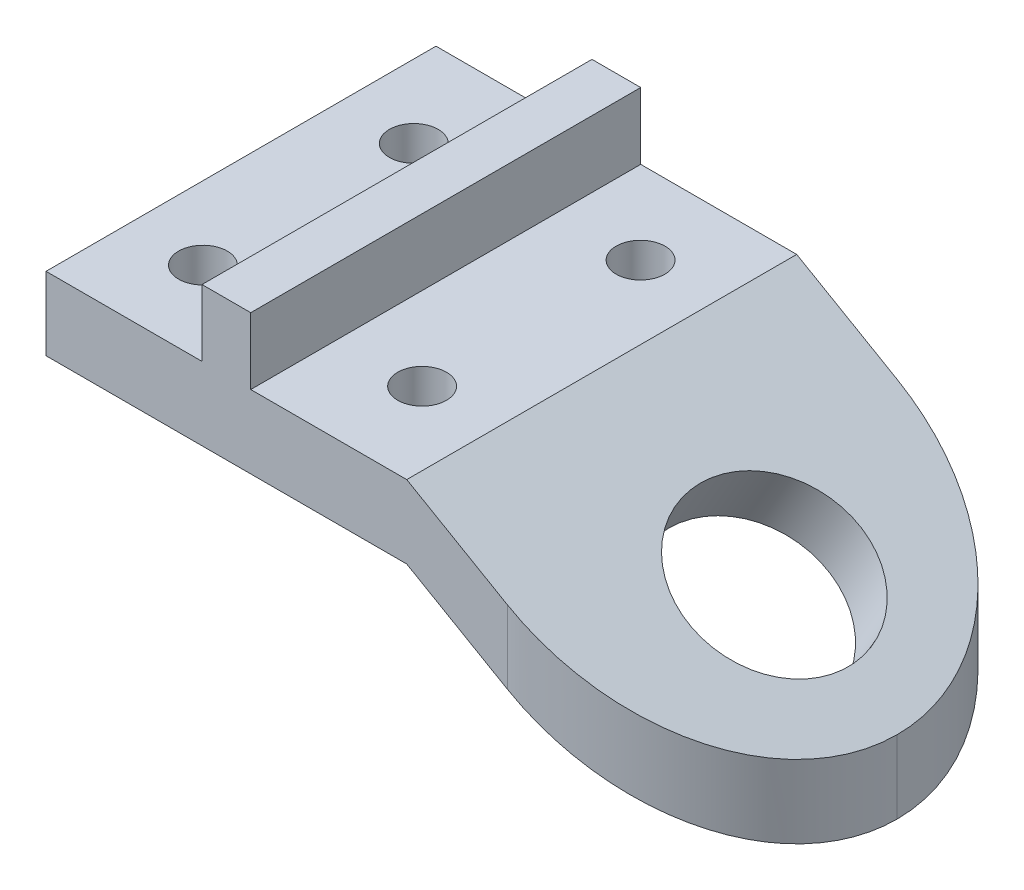
ISO-10303-21;
HEADER;
FILE_DESCRIPTION(('STEP AP214'),'2;1');
FILE_NAME('part.step','',(''),(''),'','','');
FILE_SCHEMA(('AUTOMOTIVE_DESIGN { 1 0 10303 214 1 1 1 1 }'));
ENDSEC;
DATA;
#1=APPLICATION_CONTEXT('core data for automotive mechanical design processes');
#2=APPLICATION_PROTOCOL_DEFINITION('international standard','automotive_design',2000,#1);
#3=PRODUCT_CONTEXT('',#1,'mechanical');
#4=PRODUCT('Part','Part','',(#3));
#5=PRODUCT_RELATED_PRODUCT_CATEGORY('part','',(#4));
#6=PRODUCT_DEFINITION_FORMATION('','',#4);
#7=PRODUCT_DEFINITION_CONTEXT('part definition',#1,'design');
#8=PRODUCT_DEFINITION('design','',#6,#7);
#9=PRODUCT_DEFINITION_SHAPE('','',#8);
#10=(LENGTH_UNIT() NAMED_UNIT(*) SI_UNIT(.MILLI.,.METRE.));
#11=(NAMED_UNIT(*) PLANE_ANGLE_UNIT() SI_UNIT($,.RADIAN.));
#12=(NAMED_UNIT(*) SI_UNIT($,.STERADIAN.) SOLID_ANGLE_UNIT());
#13=UNCERTAINTY_MEASURE_WITH_UNIT(LENGTH_MEASURE(1.E-05),#10,'distance_accuracy_value','');
#14=(GEOMETRIC_REPRESENTATION_CONTEXT(3) GLOBAL_UNCERTAINTY_ASSIGNED_CONTEXT((#13)) GLOBAL_UNIT_ASSIGNED_CONTEXT((#10,
#11,#12)) REPRESENTATION_CONTEXT('',''));
#15=CARTESIAN_POINT('',(0.,0.,0.));
#16=DIRECTION('',(0.,0.,1.));
#17=DIRECTION('',(1.,0.,0.));
#18=AXIS2_PLACEMENT_3D('',#15,#16,#17);
#19=CARTESIAN_POINT('',(-28.4533333333331,0.,80.));
#20=DIRECTION('',(1.,0.,0.));
#21=DIRECTION('',(0.,0.,-1.));
#22=AXIS2_PLACEMENT_3D('',#19,#20,#21);
#23=PLANE('',#22);
#24=DIRECTION('',(0.,-1.,0.));
#25=VECTOR('',#24,1.);
#26=CARTESIAN_POINT('',(-28.4533333333331,0.,0.));
#27=LINE('',#26,#25);
#28=CARTESIAN_POINT('',(-28.4533333333331,15.,0.));
#29=VERTEX_POINT('',#28);
#30=CARTESIAN_POINT('',(-28.4533333333331,0.,0.));
#31=VERTEX_POINT('',#30);
#32=EDGE_CURVE('E145',#29,#31,#27,.T.);
#33=ORIENTED_EDGE('',*,*,#32,.T.);
#34=DIRECTION('',(0.,0.,-1.));
#35=VECTOR('',#34,1.);
#36=CARTESIAN_POINT('',(-28.4533333333331,0.,80.));
#37=LINE('',#36,#35);
#38=CARTESIAN_POINT('',(-28.4533333333331,0.,80.));
#39=VERTEX_POINT('',#38);
#40=EDGE_CURVE('E125',#39,#31,#37,.T.);
#41=ORIENTED_EDGE('',*,*,#40,.F.);
#42=DIRECTION('',(0.,-1.,0.));
#43=VECTOR('',#42,1.);
#44=CARTESIAN_POINT('',(-28.4533333333331,0.,80.));
#45=LINE('',#44,#43);
#46=CARTESIAN_POINT('',(-28.4533333333331,15.,80.));
#47=VERTEX_POINT('',#46);
#48=EDGE_CURVE('E132',#47,#39,#45,.T.);
#49=ORIENTED_EDGE('',*,*,#48,.F.);
#50=DIRECTION('',(0.,0.,-1.));
#51=VECTOR('',#50,1.);
#52=CARTESIAN_POINT('',(-28.4533333333331,15.,80.));
#53=LINE('',#52,#51);
#54=EDGE_CURVE('E200',#47,#29,#53,.T.);
#55=ORIENTED_EDGE('',*,*,#54,.T.);
#56=EDGE_LOOP('',(#33,#41,#49,#55));
#57=FACE_BOUND('',#56,.T.);
#58=ADVANCED_FACE('F39',(#57),#23,.F.);
#59=CARTESIAN_POINT('',(-28.4533333333331,0.,80.));
#60=DIRECTION('',(0.,1.,0.));
#61=DIRECTION('',(-1.,0.,0.));
#62=AXIS2_PLACEMENT_3D('',#59,#60,#61);
#63=PLANE('',#62);
#64=CARTESIAN_POINT('',(30.5466666666669,0.,17.032746754983));
#65=DIRECTION('',(0.,1.,0.));
#66=DIRECTION('',(-1.,0.,0.));
#67=AXIS2_PLACEMENT_3D('',#64,#65,#66);
#68=CIRCLE('',#67,5.);
#69=CARTESIAN_POINT('',(25.5466666666669,0.,17.032746754983));
#70=VERTEX_POINT('',#69);
#71=EDGE_CURVE('E273',#70,#70,#68,.T.);
#72=ORIENTED_EDGE('',*,*,#71,.T.);
#73=EDGE_LOOP('',(#72));
#74=FACE_BOUND('',#73,.T.);
#75=CARTESIAN_POINT('',(30.5466666666669,0.,61.8436022218759));
#76=DIRECTION('',(0.,1.,0.));
#77=DIRECTION('',(-1.,0.,0.));
#78=AXIS2_PLACEMENT_3D('',#75,#76,#77);
#79=CIRCLE('',#78,5.);
#80=CARTESIAN_POINT('',(25.5466666666669,0.,61.8436022218759));
#81=VERTEX_POINT('',#80);
#82=EDGE_CURVE('E363',#81,#81,#79,.T.);
#83=ORIENTED_EDGE('',*,*,#82,.T.);
#84=EDGE_LOOP('',(#83));
#85=FACE_BOUND('',#84,.T.);
#86=CARTESIAN_POINT('',(-13.4533333333331,0.,19.5508010784763));
#87=DIRECTION('',(0.,1.,0.));
#88=DIRECTION('',(0.,0.,1.));
#89=AXIS2_PLACEMENT_3D('',#86,#87,#88);
#90=CIRCLE('',#89,5.);
#91=CARTESIAN_POINT('',(-13.4533333333331,0.,24.5508010784763));
#92=VERTEX_POINT('',#91);
#93=EDGE_CURVE('E259',#92,#92,#90,.T.);
#94=ORIENTED_EDGE('',*,*,#93,.T.);
#95=EDGE_LOOP('',(#94));
#96=FACE_BOUND('',#95,.T.);
#97=CARTESIAN_POINT('',(-13.4533333333331,0.,62.8021231944298));
#98=DIRECTION('',(0.,1.,0.));
#99=DIRECTION('',(0.,0.,1.));
#100=AXIS2_PLACEMENT_3D('',#97,#98,#99);
#101=CIRCLE('',#100,5.);
#102=CARTESIAN_POINT('',(-13.4533333333331,0.,67.8021231944299));
#103=VERTEX_POINT('',#102);
#104=EDGE_CURVE('E269',#103,#103,#101,.T.);
#105=ORIENTED_EDGE('',*,*,#104,.T.);
#106=EDGE_LOOP('',(#105));
#107=FACE_BOUND('',#106,.T.);
#108=DIRECTION('',(1.,0.,0.));
#109=VECTOR('',#108,1.);
#110=CARTESIAN_POINT('',(-28.4533333333331,0.,0.));
#111=LINE('',#110,#109);
#112=CARTESIAN_POINT('',(45.5466666666668,0.,0.));
#113=VERTEX_POINT('',#112);
#114=EDGE_CURVE('E178',#31,#113,#111,.T.);
#115=ORIENTED_EDGE('',*,*,#114,.T.);
#116=DIRECTION('',(0.,0.,-1.));
#117=VECTOR('',#116,1.);
#118=CARTESIAN_POINT('',(45.5466666666668,0.,80.));
#119=LINE('',#118,#117);
#120=CARTESIAN_POINT('',(45.5466666666668,0.,80.));
#121=VERTEX_POINT('',#120);
#122=EDGE_CURVE('E128',#121,#113,#119,.T.);
#123=ORIENTED_EDGE('',*,*,#122,.F.);
#124=DIRECTION('',(1.,0.,0.));
#125=VECTOR('',#124,1.);
#126=CARTESIAN_POINT('',(-28.4533333333331,0.,80.));
#127=LINE('',#126,#125);
#128=EDGE_CURVE('E121',#39,#121,#127,.T.);
#129=ORIENTED_EDGE('',*,*,#128,.F.);
#130=ORIENTED_EDGE('',*,*,#40,.T.);
#131=EDGE_LOOP('',(#115,#123,#129,#130));
#132=FACE_BOUND('',#131,.T.);
#133=ADVANCED_FACE('F123',(#74,#85,#96,#107,#132),#63,.F.);
#134=CARTESIAN_POINT('',(45.5466666666668,0.,80.));
#135=DIRECTION('',(0.499999999999996,0.866025403784441,0.));
#136=DIRECTION('',(-0.866025403784441,0.499999999999996,0.));
#137=AXIS2_PLACEMENT_3D('',#134,#135,#136);
#138=PLANE('',#137);
#139=CARTESIAN_POINT('',(73.6924922896611,-16.2499999999999,39.2299884332488));
#140=DIRECTION('',(0.499999999999996,0.866025403784441,0.));
#141=DIRECTION('',(-0.866025403784441,0.499999999999996,0.));
#142=AXIS2_PLACEMENT_3D('',#139,#140,#141);
#143=CIRCLE('',#142,17.5);
#144=CARTESIAN_POINT('',(58.5370477234334,-7.49999999999993,39.2299884332488));
#145=VERTEX_POINT('',#144);
#146=EDGE_CURVE('E350',#145,#145,#143,.T.);
#147=ORIENTED_EDGE('',*,*,#146,.T.);
#148=EDGE_LOOP('',(#147));
#149=FACE_BOUND('',#148,.T.);
#150=DIRECTION('',(0.866025403784441,-0.499999999999996,0.));
#151=VECTOR('',#150,1.);
#152=CARTESIAN_POINT('',(45.5466666666668,0.,0.));
#153=LINE('',#152,#151);
#154=CARTESIAN_POINT('',(66.1684449315776,-11.9059892324149,0.));
#155=VERTEX_POINT('',#154);
#156=EDGE_CURVE('E171',#113,#155,#153,.T.);
#157=ORIENTED_EDGE('',*,*,#156,.T.);
#158=CARTESIAN_POINT('',(66.1684449315776,-11.9059892324149,40.));
#159=DIRECTION('',(0.499999999999996,0.866025403784441,0.));
#160=DIRECTION('',(0.866025403784441,-0.499999999999996,0.));
#161=AXIS2_PLACEMENT_3D('',#158,#159,#160);
#162=ELLIPSE('',#161,46.1880215351699,40.);
#163=CARTESIAN_POINT('',(106.168444931578,-34.9999999999997,40.));
#164=VERTEX_POINT('',#163);
#165=EDGE_CURVE('E49',#155,#164,#162,.F.);
#166=ORIENTED_EDGE('',*,*,#165,.T.);
#167=CARTESIAN_POINT('',(66.1684449315776,-11.9059892324149,40.));
#168=DIRECTION('',(0.499999999999996,0.866025403784441,0.));
#169=DIRECTION('',(-0.866025403784441,0.499999999999996,0.));
#170=AXIS2_PLACEMENT_3D('',#167,#168,#169);
#171=ELLIPSE('',#170,46.1880215351699,40.);
#172=CARTESIAN_POINT('',(66.1684449315776,-11.9059892324149,80.));
#173=VERTEX_POINT('',#172);
#174=EDGE_CURVE('E56',#164,#173,#171,.F.);
#175=ORIENTED_EDGE('',*,*,#174,.T.);
#176=DIRECTION('',(0.866025403784441,-0.499999999999996,0.));
#177=VECTOR('',#176,1.);
#178=CARTESIAN_POINT('',(45.5466666666668,0.,80.));
#179=LINE('',#178,#177);
#180=EDGE_CURVE('E131',#121,#173,#179,.T.);
#181=ORIENTED_EDGE('',*,*,#180,.F.);
#182=ORIENTED_EDGE('',*,*,#122,.T.);
#183=EDGE_LOOP('',(#157,#166,#175,#181,#182));
#184=FACE_BOUND('',#183,.T.);
#185=ADVANCED_FACE('F176',(#149,#184),#138,.F.);
#186=CARTESIAN_POINT('',(45.5466666666669,15.0000000000003,80.));
#187=DIRECTION('',(-0.500000000000001,-0.866025403784438,0.));
#188=DIRECTION('',(0.866025403784438,-0.500000000000001,0.));
#189=AXIS2_PLACEMENT_3D('',#186,#187,#188);
#190=PLANE('',#189);
#191=CARTESIAN_POINT('',(80.1876828180445,-4.9999999999997,39.2299884332488));
#192=DIRECTION('',(0.500000000000001,0.866025403784438,0.));
#193=DIRECTION('',(-0.866025403784438,0.500000000000001,0.));
#194=AXIS2_PLACEMENT_3D('',#191,#192,#193);
#195=CIRCLE('',#194,17.5);
#196=CARTESIAN_POINT('',(65.0322382518168,3.75000000000032,39.2299884332488));
#197=VERTEX_POINT('',#196);
#198=EDGE_CURVE('E347',#197,#197,#195,.T.);
#199=ORIENTED_EDGE('',*,*,#198,.F.);
#200=EDGE_LOOP('',(#199));
#201=FACE_BOUND('',#200,.T.);
#202=CARTESIAN_POINT('',(66.1684449315776,3.09401076758535,40.));
#203=DIRECTION('',(-0.500000000000001,-0.866025403784438,0.));
#204=DIRECTION('',(-0.866025403784438,0.500000000000001,0.));
#205=AXIS2_PLACEMENT_3D('',#202,#203,#204);
#206=ELLIPSE('',#205,46.1880215351701,40.);
#207=CARTESIAN_POINT('',(66.1684449315776,3.09401076758535,80.));
#208=VERTEX_POINT('',#207);
#209=CARTESIAN_POINT('',(106.168444931578,-19.9999999999997,40.));
#210=VERTEX_POINT('',#209);
#211=EDGE_CURVE('E147',#208,#210,#206,.F.);
#212=ORIENTED_EDGE('',*,*,#211,.T.);
#213=CARTESIAN_POINT('',(66.1684449315776,3.09401076758535,40.));
#214=DIRECTION('',(-0.500000000000001,-0.866025403784438,0.));
#215=DIRECTION('',(0.866025403784438,-0.500000000000001,0.));
#216=AXIS2_PLACEMENT_3D('',#213,#214,#215);
#217=ELLIPSE('',#216,46.1880215351701,40.);
#218=CARTESIAN_POINT('',(66.1684449315776,3.09401076758535,0.));
#219=VERTEX_POINT('',#218);
#220=EDGE_CURVE('E151',#210,#219,#217,.F.);
#221=ORIENTED_EDGE('',*,*,#220,.T.);
#222=DIRECTION('',(-0.866025403784438,0.500000000000001,0.));
#223=VECTOR('',#222,1.);
#224=CARTESIAN_POINT('',(45.5466666666669,15.0000000000003,0.));
#225=LINE('',#224,#223);
#226=CARTESIAN_POINT('',(45.5466666666669,15.0000000000003,0.));
#227=VERTEX_POINT('',#226);
#228=EDGE_CURVE('E173',#219,#227,#225,.T.);
#229=ORIENTED_EDGE('',*,*,#228,.T.);
#230=DIRECTION('',(0.,0.,-1.));
#231=VECTOR('',#230,1.);
#232=CARTESIAN_POINT('',(45.5466666666669,15.0000000000003,80.));
#233=LINE('',#232,#231);
#234=CARTESIAN_POINT('',(45.5466666666669,15.0000000000003,80.));
#235=VERTEX_POINT('',#234);
#236=EDGE_CURVE('E153',#235,#227,#233,.T.);
#237=ORIENTED_EDGE('',*,*,#236,.F.);
#238=DIRECTION('',(-0.866025403784438,0.500000000000001,0.));
#239=VECTOR('',#238,1.);
#240=CARTESIAN_POINT('',(45.5466666666669,15.0000000000003,80.));
#241=LINE('',#240,#239);
#242=EDGE_CURVE('E279',#208,#235,#241,.T.);
#243=ORIENTED_EDGE('',*,*,#242,.F.);
#244=EDGE_LOOP('',(#212,#221,#229,#237,#243));
#245=FACE_BOUND('',#244,.T.);
#246=ADVANCED_FACE('F284',(#201,#245),#190,.F.);
#247=CARTESIAN_POINT('',(13.5466666666669,15.0000000000003,80.));
#248=DIRECTION('',(0.,-1.,0.));
#249=DIRECTION('',(0.,0.,-1.));
#250=AXIS2_PLACEMENT_3D('',#247,#248,#249);
#251=PLANE('',#250);
#252=CARTESIAN_POINT('',(30.5466666666669,15.0000000000003,17.032746754983));
#253=DIRECTION('',(0.,1.,0.));
#254=DIRECTION('',(0.,0.,1.));
#255=AXIS2_PLACEMENT_3D('',#252,#253,#254);
#256=CIRCLE('',#255,5.);
#257=CARTESIAN_POINT('',(30.5466666666669,15.0000000000003,22.032746754983));
#258=VERTEX_POINT('',#257);
#259=EDGE_CURVE('E357',#258,#258,#256,.T.);
#260=ORIENTED_EDGE('',*,*,#259,.F.);
#261=EDGE_LOOP('',(#260));
#262=FACE_BOUND('',#261,.T.);
#263=CARTESIAN_POINT('',(30.5466666666669,15.0000000000003,61.8436022218759));
#264=DIRECTION('',(0.,1.,0.));
#265=DIRECTION('',(0.,0.,1.));
#266=AXIS2_PLACEMENT_3D('',#263,#264,#265);
#267=CIRCLE('',#266,5.);
#268=CARTESIAN_POINT('',(30.5466666666669,15.0000000000003,66.8436022218759));
#269=VERTEX_POINT('',#268);
#270=EDGE_CURVE('E352',#269,#269,#267,.T.);
#271=ORIENTED_EDGE('',*,*,#270,.F.);
#272=EDGE_LOOP('',(#271));
#273=FACE_BOUND('',#272,.T.);
#274=DIRECTION('',(-1.,0.,0.));
#275=VECTOR('',#274,1.);
#276=CARTESIAN_POINT('',(13.5466666666669,15.0000000000003,0.));
#277=LINE('',#276,#275);
#278=CARTESIAN_POINT('',(13.5466666666669,15.0000000000003,0.));
#279=VERTEX_POINT('',#278);
#280=EDGE_CURVE('E182',#227,#279,#277,.T.);
#281=ORIENTED_EDGE('',*,*,#280,.T.);
#282=DIRECTION('',(0.,0.,-1.));
#283=VECTOR('',#282,1.);
#284=CARTESIAN_POINT('',(13.5466666666669,15.0000000000003,80.));
#285=LINE('',#284,#283);
#286=CARTESIAN_POINT('',(13.5466666666669,15.0000000000003,80.));
#287=VERTEX_POINT('',#286);
#288=EDGE_CURVE('E215',#287,#279,#285,.T.);
#289=ORIENTED_EDGE('',*,*,#288,.F.);
#290=DIRECTION('',(-1.,0.,0.));
#291=VECTOR('',#290,1.);
#292=CARTESIAN_POINT('',(13.5466666666669,15.0000000000003,80.));
#293=LINE('',#292,#291);
#294=EDGE_CURVE('E225',#235,#287,#293,.T.);
#295=ORIENTED_EDGE('',*,*,#294,.F.);
#296=ORIENTED_EDGE('',*,*,#236,.T.);
#297=EDGE_LOOP('',(#281,#289,#295,#296));
#298=FACE_BOUND('',#297,.T.);
#299=ADVANCED_FACE('F223',(#262,#273,#298),#251,.F.);
#300=CARTESIAN_POINT('',(13.5466666666669,28.6533333333333,80.));
#301=DIRECTION('',(-1.,0.,0.));
#302=DIRECTION('',(0.,0.,1.));
#303=AXIS2_PLACEMENT_3D('',#300,#301,#302);
#304=PLANE('',#303);
#305=DIRECTION('',(0.,1.,0.));
#306=VECTOR('',#305,1.);
#307=CARTESIAN_POINT('',(13.5466666666669,28.6533333333333,0.));
#308=LINE('',#307,#306);
#309=CARTESIAN_POINT('',(13.5466666666669,28.6533333333333,0.));
#310=VERTEX_POINT('',#309);
#311=EDGE_CURVE('E189',#279,#310,#308,.T.);
#312=ORIENTED_EDGE('',*,*,#311,.T.);
#313=DIRECTION('',(0.,0.,-1.));
#314=VECTOR('',#313,1.);
#315=CARTESIAN_POINT('',(13.5466666666669,28.6533333333333,80.));
#316=LINE('',#315,#314);
#317=CARTESIAN_POINT('',(13.5466666666669,28.6533333333333,80.));
#318=VERTEX_POINT('',#317);
#319=EDGE_CURVE('E211',#318,#310,#316,.T.);
#320=ORIENTED_EDGE('',*,*,#319,.F.);
#321=DIRECTION('',(0.,1.,0.));
#322=VECTOR('',#321,1.);
#323=CARTESIAN_POINT('',(13.5466666666669,28.6533333333333,80.));
#324=LINE('',#323,#322);
#325=EDGE_CURVE('E243',#287,#318,#324,.T.);
#326=ORIENTED_EDGE('',*,*,#325,.F.);
#327=ORIENTED_EDGE('',*,*,#288,.T.);
#328=EDGE_LOOP('',(#312,#320,#326,#327));
#329=FACE_BOUND('',#328,.T.);
#330=ADVANCED_FACE('F233',(#329),#304,.F.);
#331=CARTESIAN_POINT('',(3.54666666666694,28.6533333333333,80.));
#332=DIRECTION('',(0.,-1.,0.));
#333=DIRECTION('',(0.,0.,-1.));
#334=AXIS2_PLACEMENT_3D('',#331,#332,#333);
#335=PLANE('',#334);
#336=DIRECTION('',(-1.,0.,0.));
#337=VECTOR('',#336,1.);
#338=CARTESIAN_POINT('',(3.54666666666694,28.6533333333333,0.));
#339=LINE('',#338,#337);
#340=CARTESIAN_POINT('',(3.54666666666694,28.6533333333333,0.));
#341=VERTEX_POINT('',#340);
#342=EDGE_CURVE('E192',#310,#341,#339,.T.);
#343=ORIENTED_EDGE('',*,*,#342,.T.);
#344=DIRECTION('',(0.,0.,-1.));
#345=VECTOR('',#344,1.);
#346=CARTESIAN_POINT('',(3.54666666666694,28.6533333333333,80.));
#347=LINE('',#346,#345);
#348=CARTESIAN_POINT('',(3.54666666666694,28.6533333333333,80.));
#349=VERTEX_POINT('',#348);
#350=EDGE_CURVE('E207',#349,#341,#347,.T.);
#351=ORIENTED_EDGE('',*,*,#350,.F.);
#352=DIRECTION('',(-1.,0.,0.));
#353=VECTOR('',#352,1.);
#354=CARTESIAN_POINT('',(3.54666666666694,28.6533333333333,80.));
#355=LINE('',#354,#353);
#356=EDGE_CURVE('E239',#318,#349,#355,.T.);
#357=ORIENTED_EDGE('',*,*,#356,.F.);
#358=ORIENTED_EDGE('',*,*,#319,.T.);
#359=EDGE_LOOP('',(#343,#351,#357,#358));
#360=FACE_BOUND('',#359,.T.);
#361=ADVANCED_FACE('F237',(#360),#335,.F.);
#362=CARTESIAN_POINT('',(3.54666666666694,15.,80.));
#363=DIRECTION('',(1.,0.,0.));
#364=DIRECTION('',(0.,0.,-1.));
#365=AXIS2_PLACEMENT_3D('',#362,#363,#364);
#366=PLANE('',#365);
#367=DIRECTION('',(0.,-1.,0.));
#368=VECTOR('',#367,1.);
#369=CARTESIAN_POINT('',(3.54666666666694,15.,0.));
#370=LINE('',#369,#368);
#371=CARTESIAN_POINT('',(3.54666666666694,15.,0.));
#372=VERTEX_POINT('',#371);
#373=EDGE_CURVE('E195',#341,#372,#370,.T.);
#374=ORIENTED_EDGE('',*,*,#373,.T.);
#375=DIRECTION('',(0.,0.,-1.));
#376=VECTOR('',#375,1.);
#377=CARTESIAN_POINT('',(3.54666666666694,15.,80.));
#378=LINE('',#377,#376);
#379=CARTESIAN_POINT('',(3.54666666666694,15.,80.));
#380=VERTEX_POINT('',#379);
#381=EDGE_CURVE('E203',#380,#372,#378,.T.);
#382=ORIENTED_EDGE('',*,*,#381,.F.);
#383=DIRECTION('',(0.,-1.,0.));
#384=VECTOR('',#383,1.);
#385=CARTESIAN_POINT('',(3.54666666666694,15.,80.));
#386=LINE('',#385,#384);
#387=EDGE_CURVE('E242',#349,#380,#386,.T.);
#388=ORIENTED_EDGE('',*,*,#387,.F.);
#389=ORIENTED_EDGE('',*,*,#350,.T.);
#390=EDGE_LOOP('',(#374,#382,#388,#389));
#391=FACE_BOUND('',#390,.T.);
#392=ADVANCED_FACE('F317',(#391),#366,.F.);
#393=CARTESIAN_POINT('',(-28.4533333333331,15.,80.));
#394=DIRECTION('',(0.,-1.,0.));
#395=DIRECTION('',(0.,0.,-1.));
#396=AXIS2_PLACEMENT_3D('',#393,#394,#395);
#397=PLANE('',#396);
#398=CARTESIAN_POINT('',(-13.4533333333331,15.,19.5508010784763));
#399=DIRECTION('',(0.,-1.,0.));
#400=DIRECTION('',(0.,0.,-1.));
#401=AXIS2_PLACEMENT_3D('',#398,#399,#400);
#402=CIRCLE('',#401,5.);
#403=CARTESIAN_POINT('',(-13.4533333333331,15.,14.5508010784763));
#404=VERTEX_POINT('',#403);
#405=EDGE_CURVE('E255',#404,#404,#402,.T.);
#406=ORIENTED_EDGE('',*,*,#405,.T.);
#407=EDGE_LOOP('',(#406));
#408=FACE_BOUND('',#407,.T.);
#409=CARTESIAN_POINT('',(-13.4533333333331,15.,62.8021231944298));
#410=DIRECTION('',(0.,-1.,0.));
#411=DIRECTION('',(0.,0.,-1.));
#412=AXIS2_PLACEMENT_3D('',#409,#410,#411);
#413=CIRCLE('',#412,5.);
#414=CARTESIAN_POINT('',(-13.4533333333331,15.,57.8021231944299));
#415=VERTEX_POINT('',#414);
#416=EDGE_CURVE('E265',#415,#415,#413,.T.);
#417=ORIENTED_EDGE('',*,*,#416,.T.);
#418=EDGE_LOOP('',(#417));
#419=FACE_BOUND('',#418,.T.);
#420=DIRECTION('',(-1.,0.,0.));
#421=VECTOR('',#420,1.);
#422=CARTESIAN_POINT('',(-28.4533333333331,15.,0.));
#423=LINE('',#422,#421);
#424=EDGE_CURVE('E142',#372,#29,#423,.T.);
#425=ORIENTED_EDGE('',*,*,#424,.T.);
#426=ORIENTED_EDGE('',*,*,#54,.F.);
#427=DIRECTION('',(-1.,0.,0.));
#428=VECTOR('',#427,1.);
#429=CARTESIAN_POINT('',(-28.4533333333331,15.,80.));
#430=LINE('',#429,#428);
#431=EDGE_CURVE('E137',#380,#47,#430,.T.);
#432=ORIENTED_EDGE('',*,*,#431,.F.);
#433=ORIENTED_EDGE('',*,*,#381,.T.);
#434=EDGE_LOOP('',(#425,#426,#432,#433));
#435=FACE_BOUND('',#434,.T.);
#436=ADVANCED_FACE('F320',(#408,#419,#435),#397,.F.);
#437=CARTESIAN_POINT('',(0.,0.,80.));
#438=DIRECTION('',(0.,0.,-1.));
#439=DIRECTION('',(-1.,0.,0.));
#440=AXIS2_PLACEMENT_3D('',#437,#438,#439);
#441=PLANE('',#440);
#442=ORIENTED_EDGE('',*,*,#180,.T.);
#443=DIRECTION('',(0.,1.,0.));
#444=VECTOR('',#443,1.);
#445=CARTESIAN_POINT('',(66.1684449315776,0.,80.));
#446=LINE('',#445,#444);
#447=EDGE_CURVE('E11',#173,#208,#446,.T.);
#448=ORIENTED_EDGE('',*,*,#447,.T.);
#449=ORIENTED_EDGE('',*,*,#242,.T.);
#450=ORIENTED_EDGE('',*,*,#294,.T.);
#451=ORIENTED_EDGE('',*,*,#325,.T.);
#452=ORIENTED_EDGE('',*,*,#356,.T.);
#453=ORIENTED_EDGE('',*,*,#387,.T.);
#454=ORIENTED_EDGE('',*,*,#431,.T.);
#455=ORIENTED_EDGE('',*,*,#48,.T.);
#456=ORIENTED_EDGE('',*,*,#128,.T.);
#457=EDGE_LOOP('',(#442,#448,#449,#450,#451,#452,#453,#454,#455,#456));
#458=FACE_BOUND('',#457,.T.);
#459=ADVANCED_FACE('F135',(#458),#441,.F.);
#460=CARTESIAN_POINT('',(0.,0.,0.));
#461=DIRECTION('',(0.,0.,-1.));
#462=DIRECTION('',(-1.,0.,0.));
#463=AXIS2_PLACEMENT_3D('',#460,#461,#462);
#464=PLANE('',#463);
#465=ORIENTED_EDGE('',*,*,#228,.F.);
#466=DIRECTION('',(0.,1.,0.));
#467=VECTOR('',#466,1.);
#468=CARTESIAN_POINT('',(66.1684449315776,-34.9999999999997,0.));
#469=LINE('',#468,#467);
#470=EDGE_CURVE('E159',#219,#155,#469,.F.);
#471=ORIENTED_EDGE('',*,*,#470,.T.);
#472=ORIENTED_EDGE('',*,*,#156,.F.);
#473=ORIENTED_EDGE('',*,*,#114,.F.);
#474=ORIENTED_EDGE('',*,*,#32,.F.);
#475=ORIENTED_EDGE('',*,*,#424,.F.);
#476=ORIENTED_EDGE('',*,*,#373,.F.);
#477=ORIENTED_EDGE('',*,*,#342,.F.);
#478=ORIENTED_EDGE('',*,*,#311,.F.);
#479=ORIENTED_EDGE('',*,*,#280,.F.);
#480=EDGE_LOOP('',(#465,#471,#472,#473,#474,#475,#476,#477,#478,#479));
#481=FACE_BOUND('',#480,.T.);
#482=ADVANCED_FACE('F170',(#481),#464,.T.);
#483=CARTESIAN_POINT('',(66.1684449315776,0.,40.));
#484=DIRECTION('',(0.,1.,0.));
#485=DIRECTION('',(0.,0.,1.));
#486=AXIS2_PLACEMENT_3D('',#483,#484,#485);
#487=CYLINDRICAL_SURFACE('',#486,40.);
#488=ORIENTED_EDGE('',*,*,#447,.F.);
#489=ORIENTED_EDGE('',*,*,#174,.F.);
#490=DIRECTION('',(0.,1.,0.));
#491=VECTOR('',#490,1.);
#492=CARTESIAN_POINT('',(106.168444931578,-19.9999999999997,40.));
#493=LINE('',#492,#491);
#494=EDGE_CURVE('E43',#210,#164,#493,.F.);
#495=ORIENTED_EDGE('',*,*,#494,.F.);
#496=ORIENTED_EDGE('',*,*,#211,.F.);
#497=EDGE_LOOP('',(#488,#489,#495,#496));
#498=FACE_BOUND('',#497,.T.);
#499=ADVANCED_FACE('F41',(#498),#487,.T.);
#500=CARTESIAN_POINT('',(66.1684449315776,-19.9999999999997,40.));
#501=DIRECTION('',(0.,-1.,0.));
#502=DIRECTION('',(0.,0.,-1.));
#503=AXIS2_PLACEMENT_3D('',#500,#501,#502);
#504=CYLINDRICAL_SURFACE('',#503,40.);
#505=ORIENTED_EDGE('',*,*,#165,.F.);
#506=ORIENTED_EDGE('',*,*,#470,.F.);
#507=ORIENTED_EDGE('',*,*,#220,.F.);
#508=ORIENTED_EDGE('',*,*,#494,.T.);
#509=EDGE_LOOP('',(#505,#506,#507,#508));
#510=FACE_BOUND('',#509,.T.);
#511=ADVANCED_FACE('F286',(#510),#504,.T.);
#512=CARTESIAN_POINT('',(-13.4533333333331,29.142135623731,62.8021231944298));
#513=DIRECTION('',(0.,-1.,0.));
#514=DIRECTION('',(0.,0.,-1.));
#515=AXIS2_PLACEMENT_3D('',#512,#513,#514);
#516=CYLINDRICAL_SURFACE('',#515,5.);
#517=ORIENTED_EDGE('',*,*,#416,.F.);
#518=EDGE_LOOP('',(#517));
#519=FACE_BOUND('',#518,.T.);
#520=ORIENTED_EDGE('',*,*,#104,.F.);
#521=EDGE_LOOP('',(#520));
#522=FACE_BOUND('',#521,.T.);
#523=ADVANCED_FACE('F288',(#519,#522),#516,.F.);
#524=CARTESIAN_POINT('',(-13.4533333333331,29.142135623731,19.5508010784763));
#525=DIRECTION('',(0.,-1.,0.));
#526=DIRECTION('',(0.,0.,-1.));
#527=AXIS2_PLACEMENT_3D('',#524,#525,#526);
#528=CYLINDRICAL_SURFACE('',#527,5.);
#529=ORIENTED_EDGE('',*,*,#405,.F.);
#530=EDGE_LOOP('',(#529));
#531=FACE_BOUND('',#530,.T.);
#532=ORIENTED_EDGE('',*,*,#93,.F.);
#533=EDGE_LOOP('',(#532));
#534=FACE_BOUND('',#533,.T.);
#535=ADVANCED_FACE('F293',(#531,#534),#528,.F.);
#536=CARTESIAN_POINT('',(30.5466666666669,-64.9999999999997,61.8436022218759));
#537=DIRECTION('',(0.,1.,0.));
#538=DIRECTION('',(0.,0.,1.));
#539=AXIS2_PLACEMENT_3D('',#536,#537,#538);
#540=CYLINDRICAL_SURFACE('',#539,5.);
#541=ORIENTED_EDGE('',*,*,#270,.T.);
#542=EDGE_LOOP('',(#541));
#543=FACE_BOUND('',#542,.T.);
#544=ORIENTED_EDGE('',*,*,#82,.F.);
#545=EDGE_LOOP('',(#544));
#546=FACE_BOUND('',#545,.T.);
#547=ADVANCED_FACE('F330',(#543,#546),#540,.F.);
#548=CARTESIAN_POINT('',(30.5466666666669,-64.9999999999997,17.032746754983));
#549=DIRECTION('',(0.,1.,0.));
#550=DIRECTION('',(0.,0.,1.));
#551=AXIS2_PLACEMENT_3D('',#548,#549,#550);
#552=CYLINDRICAL_SURFACE('',#551,5.);
#553=ORIENTED_EDGE('',*,*,#259,.T.);
#554=EDGE_LOOP('',(#553));
#555=FACE_BOUND('',#554,.T.);
#556=ORIENTED_EDGE('',*,*,#71,.F.);
#557=EDGE_LOOP('',(#556));
#558=FACE_BOUND('',#557,.T.);
#559=ADVANCED_FACE('F334',(#555,#558),#552,.F.);
#560=CARTESIAN_POINT('',(67.1876828180445,-27.5166604983951,39.2299884332488));
#561=DIRECTION('',(0.500000000000001,0.866025403784438,0.));
#562=DIRECTION('',(-0.866025403784438,0.500000000000001,0.));
#563=AXIS2_PLACEMENT_3D('',#560,#561,#562);
#564=CYLINDRICAL_SURFACE('',#563,17.5);
#565=ORIENTED_EDGE('',*,*,#198,.T.);
#566=EDGE_LOOP('',(#565));
#567=FACE_BOUND('',#566,.T.);
#568=ORIENTED_EDGE('',*,*,#146,.F.);
#569=EDGE_LOOP('',(#568));
#570=FACE_BOUND('',#569,.T.);
#571=ADVANCED_FACE('F338',(#567,#570),#564,.F.);
#572=CLOSED_SHELL('',(#58,#133,#185,#246,#299,#330,#361,#392,#436,#459,#482,#499,#511,#523,#535,
#547,#559,#571));
#573=MANIFOLD_SOLID_BREP('B2',#572);
#574=ADVANCED_BREP_SHAPE_REPRESENTATION('',(#18,#573),#14);
#575=SHAPE_DEFINITION_REPRESENTATION(#9,#574);
ENDSEC;
END-ISO-10303-21;
